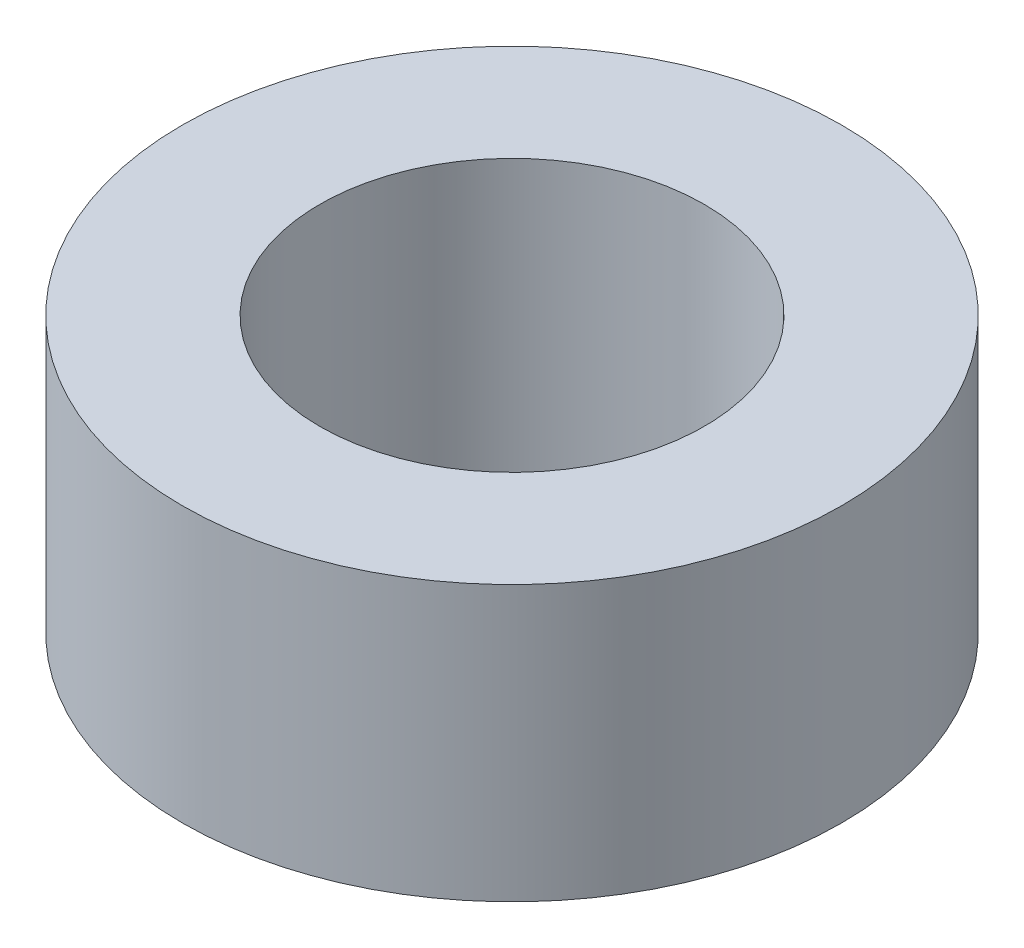
ISO-10303-21;
HEADER;
FILE_DESCRIPTION(('STEP AP214'),'2;1');
FILE_NAME('part.step','',(''),(''),'','','');
FILE_SCHEMA(('AUTOMOTIVE_DESIGN { 1 0 10303 214 1 1 1 1 }'));
ENDSEC;
DATA;
#1=APPLICATION_CONTEXT('core data for automotive mechanical design processes');
#2=APPLICATION_PROTOCOL_DEFINITION('international standard','automotive_design',2000,#1);
#3=PRODUCT_CONTEXT('',#1,'mechanical');
#4=PRODUCT('Part','Part','',(#3));
#5=PRODUCT_RELATED_PRODUCT_CATEGORY('part','',(#4));
#6=PRODUCT_DEFINITION_FORMATION('','',#4);
#7=PRODUCT_DEFINITION_CONTEXT('part definition',#1,'design');
#8=PRODUCT_DEFINITION('design','',#6,#7);
#9=PRODUCT_DEFINITION_SHAPE('','',#8);
#10=(LENGTH_UNIT() NAMED_UNIT(*) SI_UNIT(.MILLI.,.METRE.));
#11=(NAMED_UNIT(*) PLANE_ANGLE_UNIT() SI_UNIT($,.RADIAN.));
#12=(NAMED_UNIT(*) SI_UNIT($,.STERADIAN.) SOLID_ANGLE_UNIT());
#13=UNCERTAINTY_MEASURE_WITH_UNIT(LENGTH_MEASURE(1.E-05),#10,'distance_accuracy_value','');
#14=(GEOMETRIC_REPRESENTATION_CONTEXT(3) GLOBAL_UNCERTAINTY_ASSIGNED_CONTEXT((#13)) GLOBAL_UNIT_ASSIGNED_CONTEXT((#10,
#11,#12)) REPRESENTATION_CONTEXT('',''));
#15=CARTESIAN_POINT('',(0.,0.,0.));
#16=DIRECTION('',(0.,0.,1.));
#17=DIRECTION('',(1.,0.,0.));
#18=AXIS2_PLACEMENT_3D('',#15,#16,#17);
#19=CARTESIAN_POINT('',(-21.92,-83.5,52.));
#20=DIRECTION('',(0.,1.,0.));
#21=DIRECTION('',(0.,0.,1.));
#22=AXIS2_PLACEMENT_3D('',#19,#20,#21);
#23=CYLINDRICAL_SURFACE('',#22,1.75);
#24=CARTESIAN_POINT('',(-21.92,-83.5,52.));
#25=DIRECTION('',(0.,-1.,0.));
#26=DIRECTION('',(0.,0.,-1.));
#27=AXIS2_PLACEMENT_3D('',#24,#25,#26);
#28=CIRCLE('',#27,1.75);
#29=CARTESIAN_POINT('',(-21.92,-83.5,50.25));
#30=VERTEX_POINT('',#29);
#31=EDGE_CURVE('E9',#30,#30,#28,.T.);
#32=ORIENTED_EDGE('',*,*,#31,.T.);
#33=EDGE_LOOP('',(#32));
#34=FACE_BOUND('',#33,.T.);
#35=CARTESIAN_POINT('',(-21.92,-81.,52.));
#36=DIRECTION('',(0.,-1.,0.));
#37=DIRECTION('',(0.,0.,-1.));
#38=AXIS2_PLACEMENT_3D('',#35,#36,#37);
#39=CIRCLE('',#38,1.75);
#40=CARTESIAN_POINT('',(-21.92,-81.,50.25));
#41=VERTEX_POINT('',#40);
#42=EDGE_CURVE('E18',#41,#41,#39,.T.);
#43=ORIENTED_EDGE('',*,*,#42,.F.);
#44=EDGE_LOOP('',(#43));
#45=FACE_BOUND('',#44,.T.);
#46=ADVANCED_FACE('F14',(#34,#45),#23,.F.);
#47=CARTESIAN_POINT('',(-21.92,-83.5,52.));
#48=DIRECTION('',(0.,1.,0.));
#49=DIRECTION('',(0.,0.,1.));
#50=AXIS2_PLACEMENT_3D('',#47,#48,#49);
#51=CYLINDRICAL_SURFACE('',#50,3.);
#52=CARTESIAN_POINT('',(-21.92,-83.5,52.));
#53=DIRECTION('',(0.,-1.,0.));
#54=DIRECTION('',(0.,0.,-1.));
#55=AXIS2_PLACEMENT_3D('',#52,#53,#54);
#56=CIRCLE('',#55,3.);
#57=CARTESIAN_POINT('',(-21.92,-83.5,49.));
#58=VERTEX_POINT('',#57);
#59=EDGE_CURVE('E23',#58,#58,#56,.T.);
#60=ORIENTED_EDGE('',*,*,#59,.F.);
#61=EDGE_LOOP('',(#60));
#62=FACE_BOUND('',#61,.T.);
#63=CARTESIAN_POINT('',(-21.92,-81.,52.));
#64=DIRECTION('',(0.,-1.,0.));
#65=DIRECTION('',(0.,0.,-1.));
#66=AXIS2_PLACEMENT_3D('',#63,#64,#65);
#67=CIRCLE('',#66,3.);
#68=CARTESIAN_POINT('',(-21.92,-81.,49.));
#69=VERTEX_POINT('',#68);
#70=EDGE_CURVE('E34',#69,#69,#67,.T.);
#71=ORIENTED_EDGE('',*,*,#70,.T.);
#72=EDGE_LOOP('',(#71));
#73=FACE_BOUND('',#72,.T.);
#74=ADVANCED_FACE('F16',(#62,#73),#51,.T.);
#75=CARTESIAN_POINT('',(0.,-83.5,47.5));
#76=DIRECTION('',(0.,-1.,0.));
#77=DIRECTION('',(1.,0.,0.));
#78=AXIS2_PLACEMENT_3D('',#75,#76,#77);
#79=PLANE('',#78);
#80=ORIENTED_EDGE('',*,*,#31,.F.);
#81=EDGE_LOOP('',(#80));
#82=FACE_BOUND('',#81,.T.);
#83=ORIENTED_EDGE('',*,*,#59,.T.);
#84=EDGE_LOOP('',(#83));
#85=FACE_BOUND('',#84,.T.);
#86=ADVANCED_FACE('F51',(#82,#85),#79,.T.);
#87=CARTESIAN_POINT('',(0.,-81.,47.5));
#88=DIRECTION('',(0.,-1.,0.));
#89=DIRECTION('',(1.,0.,0.));
#90=AXIS2_PLACEMENT_3D('',#87,#88,#89);
#91=PLANE('',#90);
#92=ORIENTED_EDGE('',*,*,#42,.T.);
#93=EDGE_LOOP('',(#92));
#94=FACE_BOUND('',#93,.T.);
#95=ORIENTED_EDGE('',*,*,#70,.F.);
#96=EDGE_LOOP('',(#95));
#97=FACE_BOUND('',#96,.T.);
#98=ADVANCED_FACE('F43',(#94,#97),#91,.F.);
#99=CLOSED_SHELL('',(#46,#74,#86,#98));
#100=MANIFOLD_SOLID_BREP('B1',#99);
#101=ADVANCED_BREP_SHAPE_REPRESENTATION('',(#18,#100),#14);
#102=SHAPE_DEFINITION_REPRESENTATION(#9,#101);
ENDSEC;
END-ISO-10303-21;
